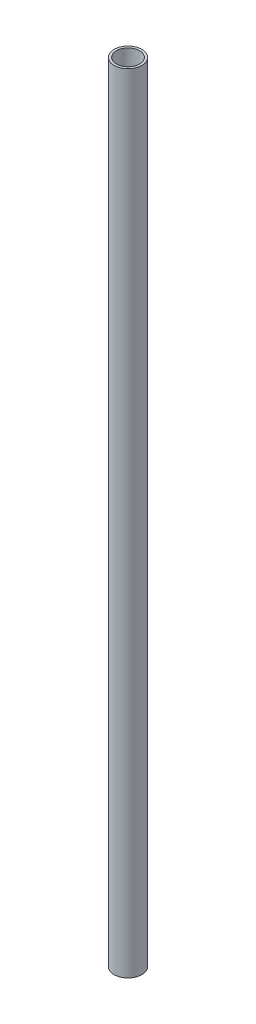
ISO-10303-21;
HEADER;
FILE_DESCRIPTION(('STEP AP214'),'2;1');
FILE_NAME('part.step','',(''),(''),'','','');
FILE_SCHEMA(('AUTOMOTIVE_DESIGN { 1 0 10303 214 1 1 1 1 }'));
ENDSEC;
DATA;
#1=APPLICATION_CONTEXT('core data for automotive mechanical design processes');
#2=APPLICATION_PROTOCOL_DEFINITION('international standard','automotive_design',2000,#1);
#3=PRODUCT_CONTEXT('',#1,'mechanical');
#4=PRODUCT('Part','Part','',(#3));
#5=PRODUCT_RELATED_PRODUCT_CATEGORY('part','',(#4));
#6=PRODUCT_DEFINITION_FORMATION('','',#4);
#7=PRODUCT_DEFINITION_CONTEXT('part definition',#1,'design');
#8=PRODUCT_DEFINITION('design','',#6,#7);
#9=PRODUCT_DEFINITION_SHAPE('','',#8);
#10=(LENGTH_UNIT() NAMED_UNIT(*) SI_UNIT(.MILLI.,.METRE.));
#11=(NAMED_UNIT(*) PLANE_ANGLE_UNIT() SI_UNIT($,.RADIAN.));
#12=(NAMED_UNIT(*) SI_UNIT($,.STERADIAN.) SOLID_ANGLE_UNIT());
#13=UNCERTAINTY_MEASURE_WITH_UNIT(LENGTH_MEASURE(1.E-05),#10,'distance_accuracy_value','');
#14=(GEOMETRIC_REPRESENTATION_CONTEXT(3) GLOBAL_UNCERTAINTY_ASSIGNED_CONTEXT((#13)) GLOBAL_UNIT_ASSIGNED_CONTEXT((#10,
#11,#12)) REPRESENTATION_CONTEXT('',''));
#15=CARTESIAN_POINT('',(0.,0.,0.));
#16=DIRECTION('',(0.,0.,1.));
#17=DIRECTION('',(1.,0.,0.));
#18=AXIS2_PLACEMENT_3D('',#15,#16,#17);
#19=CARTESIAN_POINT('',(0.,340.,0.));
#20=DIRECTION('',(0.,1.,0.));
#21=DIRECTION('',(0.,0.,1.));
#22=AXIS2_PLACEMENT_3D('',#19,#20,#21);
#23=PLANE('',#22);
#24=CARTESIAN_POINT('',(0.,340.,0.));
#25=DIRECTION('',(0.,1.,0.));
#26=DIRECTION('',(0.,0.,1.));
#27=AXIS2_PLACEMENT_3D('',#24,#25,#26);
#28=CIRCLE('',#27,6.);
#29=CARTESIAN_POINT('',(0.,340.,6.));
#30=VERTEX_POINT('',#29);
#31=EDGE_CURVE('E10',#30,#30,#28,.T.);
#32=ORIENTED_EDGE('',*,*,#31,.T.);
#33=EDGE_LOOP('',(#32));
#34=FACE_BOUND('',#33,.T.);
#35=CARTESIAN_POINT('',(0.,340.,0.));
#36=DIRECTION('',(0.,1.,0.));
#37=DIRECTION('',(0.,0.,1.));
#38=AXIS2_PLACEMENT_3D('',#35,#36,#37);
#39=CIRCLE('',#38,5.);
#40=CARTESIAN_POINT('',(0.,340.,5.));
#41=VERTEX_POINT('',#40);
#42=EDGE_CURVE('E44',#41,#41,#39,.T.);
#43=ORIENTED_EDGE('',*,*,#42,.F.);
#44=EDGE_LOOP('',(#43));
#45=FACE_BOUND('',#44,.T.);
#46=ADVANCED_FACE('F33',(#34,#45),#23,.T.);
#47=CARTESIAN_POINT('',(0.,0.,0.));
#48=DIRECTION('',(0.,1.,0.));
#49=DIRECTION('',(0.,0.,1.));
#50=AXIS2_PLACEMENT_3D('',#47,#48,#49);
#51=PLANE('',#50);
#52=CARTESIAN_POINT('',(0.,0.,0.));
#53=DIRECTION('',(0.,1.,0.));
#54=DIRECTION('',(0.,0.,1.));
#55=AXIS2_PLACEMENT_3D('',#52,#53,#54);
#56=CIRCLE('',#55,6.);
#57=CARTESIAN_POINT('',(0.,0.,6.));
#58=VERTEX_POINT('',#57);
#59=EDGE_CURVE('E37',#58,#58,#56,.T.);
#60=ORIENTED_EDGE('',*,*,#59,.F.);
#61=EDGE_LOOP('',(#60));
#62=FACE_BOUND('',#61,.T.);
#63=CARTESIAN_POINT('',(0.,0.,0.));
#64=DIRECTION('',(0.,1.,0.));
#65=DIRECTION('',(0.,0.,1.));
#66=AXIS2_PLACEMENT_3D('',#63,#64,#65);
#67=CIRCLE('',#66,5.);
#68=CARTESIAN_POINT('',(0.,0.,5.));
#69=VERTEX_POINT('',#68);
#70=EDGE_CURVE('E46',#69,#69,#67,.T.);
#71=ORIENTED_EDGE('',*,*,#70,.T.);
#72=EDGE_LOOP('',(#71));
#73=FACE_BOUND('',#72,.T.);
#74=ADVANCED_FACE('F56',(#62,#73),#51,.F.);
#75=CARTESIAN_POINT('',(0.,340.,0.));
#76=DIRECTION('',(0.,-1.,0.));
#77=DIRECTION('',(0.,0.,-1.));
#78=AXIS2_PLACEMENT_3D('',#75,#76,#77);
#79=CYLINDRICAL_SURFACE('',#78,6.);
#80=ORIENTED_EDGE('',*,*,#31,.F.);
#81=EDGE_LOOP('',(#80));
#82=FACE_BOUND('',#81,.T.);
#83=ORIENTED_EDGE('',*,*,#59,.T.);
#84=EDGE_LOOP('',(#83));
#85=FACE_BOUND('',#84,.T.);
#86=ADVANCED_FACE('F35',(#82,#85),#79,.T.);
#87=CARTESIAN_POINT('',(0.,340.,0.));
#88=DIRECTION('',(0.,-1.,0.));
#89=DIRECTION('',(0.,0.,-1.));
#90=AXIS2_PLACEMENT_3D('',#87,#88,#89);
#91=CYLINDRICAL_SURFACE('',#90,5.);
#92=ORIENTED_EDGE('',*,*,#42,.T.);
#93=EDGE_LOOP('',(#92));
#94=FACE_BOUND('',#93,.T.);
#95=ORIENTED_EDGE('',*,*,#70,.F.);
#96=EDGE_LOOP('',(#95));
#97=FACE_BOUND('',#96,.T.);
#98=ADVANCED_FACE('F52',(#94,#97),#91,.F.);
#99=CLOSED_SHELL('',(#46,#74,#86,#98));
#100=MANIFOLD_SOLID_BREP('B2',#99);
#101=ADVANCED_BREP_SHAPE_REPRESENTATION('',(#18,#100),#14);
#102=SHAPE_DEFINITION_REPRESENTATION(#9,#101);
ENDSEC;
END-ISO-10303-21;
